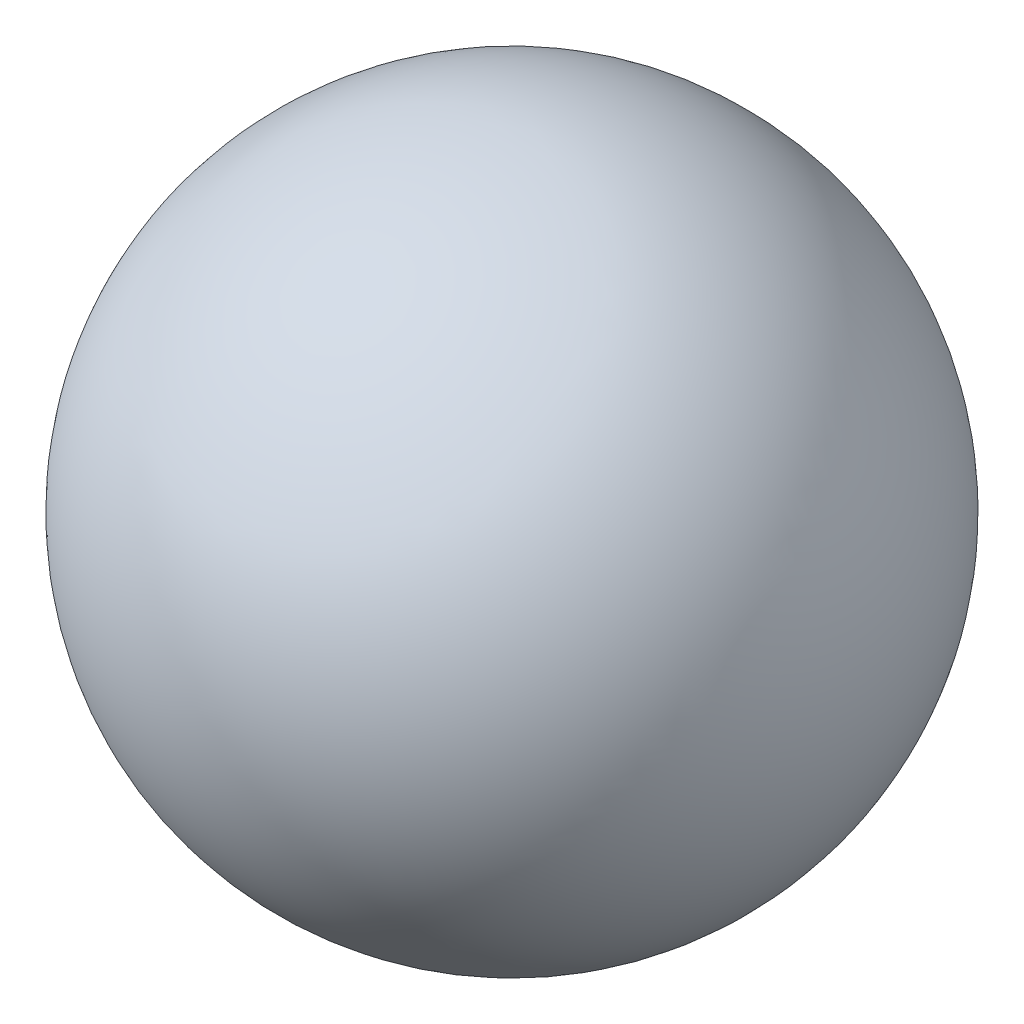
ISO-10303-21;
HEADER;
FILE_DESCRIPTION(('STEP AP214'),'2;1');
FILE_NAME('part.step','',(''),(''),'','','');
FILE_SCHEMA(('AUTOMOTIVE_DESIGN { 1 0 10303 214 1 1 1 1 }'));
ENDSEC;
DATA;
#1=APPLICATION_CONTEXT('core data for automotive mechanical design processes');
#2=APPLICATION_PROTOCOL_DEFINITION('international standard','automotive_design',2000,#1);
#3=PRODUCT_CONTEXT('',#1,'mechanical');
#4=PRODUCT('Part','Part','',(#3));
#5=PRODUCT_RELATED_PRODUCT_CATEGORY('part','',(#4));
#6=PRODUCT_DEFINITION_FORMATION('','',#4);
#7=PRODUCT_DEFINITION_CONTEXT('part definition',#1,'design');
#8=PRODUCT_DEFINITION('design','',#6,#7);
#9=PRODUCT_DEFINITION_SHAPE('','',#8);
#10=(LENGTH_UNIT() NAMED_UNIT(*) SI_UNIT(.MILLI.,.METRE.));
#11=(NAMED_UNIT(*) PLANE_ANGLE_UNIT() SI_UNIT($,.RADIAN.));
#12=(NAMED_UNIT(*) SI_UNIT($,.STERADIAN.) SOLID_ANGLE_UNIT());
#13=UNCERTAINTY_MEASURE_WITH_UNIT(LENGTH_MEASURE(1.E-05),#10,'distance_accuracy_value','');
#14=(GEOMETRIC_REPRESENTATION_CONTEXT(3) GLOBAL_UNCERTAINTY_ASSIGNED_CONTEXT((#13)) GLOBAL_UNIT_ASSIGNED_CONTEXT((#10,
#11,#12)) REPRESENTATION_CONTEXT('',''));
#15=CARTESIAN_POINT('',(0.,0.,0.));
#16=DIRECTION('',(0.,0.,1.));
#17=DIRECTION('',(1.,0.,0.));
#18=AXIS2_PLACEMENT_3D('',#15,#16,#17);
#19=CARTESIAN_POINT('',(1.5,2.95,0.));
#20=DIRECTION('',(-1.,0.,0.));
#21=DIRECTION('',(0.,-1.,0.));
#22=AXIS2_PLACEMENT_3D('',#19,#20,#21);
#23=SPHERICAL_SURFACE('',#22,0.6);
#24=CARTESIAN_POINT('',(0.9,2.95,0.));
#25=VERTEX_POINT('',#24);
#26=VERTEX_LOOP('',#25);
#27=FACE_BOUND('',#26,.T.);
#28=ADVANCED_FACE('F29',(#27),#23,.T.);
#29=CLOSED_SHELL('',(#28));
#30=MANIFOLD_SOLID_BREP('B2',#29);
#31=ADVANCED_BREP_SHAPE_REPRESENTATION('',(#18,#30),#14);
#32=SHAPE_DEFINITION_REPRESENTATION(#9,#31);
ENDSEC;
END-ISO-10303-21;
